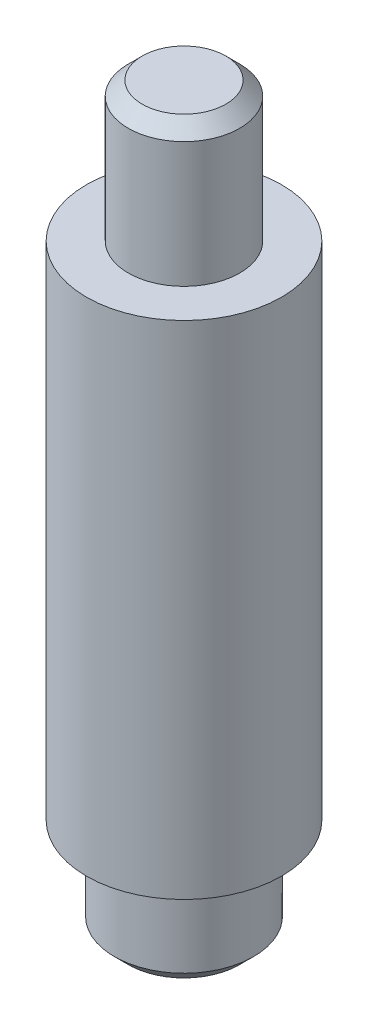
ISO-10303-21;
HEADER;
FILE_DESCRIPTION(('STEP AP214'),'2;1');
FILE_NAME('part.step','',(''),(''),'','','');
FILE_SCHEMA(('AUTOMOTIVE_DESIGN { 1 0 10303 214 1 1 1 1 }'));
ENDSEC;
DATA;
#1=APPLICATION_CONTEXT('core data for automotive mechanical design processes');
#2=APPLICATION_PROTOCOL_DEFINITION('international standard','automotive_design',2000,#1);
#3=PRODUCT_CONTEXT('',#1,'mechanical');
#4=PRODUCT('Part','Part','',(#3));
#5=PRODUCT_RELATED_PRODUCT_CATEGORY('part','',(#4));
#6=PRODUCT_DEFINITION_FORMATION('','',#4);
#7=PRODUCT_DEFINITION_CONTEXT('part definition',#1,'design');
#8=PRODUCT_DEFINITION('design','',#6,#7);
#9=PRODUCT_DEFINITION_SHAPE('','',#8);
#10=(LENGTH_UNIT() NAMED_UNIT(*) SI_UNIT(.MILLI.,.METRE.));
#11=(NAMED_UNIT(*) PLANE_ANGLE_UNIT() SI_UNIT($,.RADIAN.));
#12=(NAMED_UNIT(*) SI_UNIT($,.STERADIAN.) SOLID_ANGLE_UNIT());
#13=UNCERTAINTY_MEASURE_WITH_UNIT(LENGTH_MEASURE(1.E-05),#10,'distance_accuracy_value','');
#14=(GEOMETRIC_REPRESENTATION_CONTEXT(3) GLOBAL_UNCERTAINTY_ASSIGNED_CONTEXT((#13)) GLOBAL_UNIT_ASSIGNED_CONTEXT((#10,
#11,#12)) REPRESENTATION_CONTEXT('',''));
#15=CARTESIAN_POINT('',(0.,0.,0.));
#16=DIRECTION('',(0.,0.,1.));
#17=DIRECTION('',(1.,0.,0.));
#18=AXIS2_PLACEMENT_3D('',#15,#16,#17);
#19=CARTESIAN_POINT('',(0.,54.,3.));
#20=DIRECTION('',(0.,-1.,0.));
#21=DIRECTION('',(0.,0.,-1.));
#22=AXIS2_PLACEMENT_3D('',#19,#20,#21);
#23=PLANE('',#22);
#24=CARTESIAN_POINT('',(0.,54.,0.));
#25=DIRECTION('',(0.,-1.,0.));
#26=DIRECTION('',(0.,0.,-1.));
#27=AXIS2_PLACEMENT_3D('',#24,#25,#26);
#28=CIRCLE('',#27,3.);
#29=CARTESIAN_POINT('',(0.,54.,-3.));
#30=VERTEX_POINT('',#29);
#31=EDGE_CURVE('E10',#30,#30,#28,.T.);
#32=ORIENTED_EDGE('',*,*,#31,.F.);
#33=EDGE_LOOP('',(#32));
#34=FACE_BOUND('',#33,.T.);
#35=ADVANCED_FACE('F31',(#34),#23,.F.);
#36=CARTESIAN_POINT('',(0.,54.,0.));
#37=DIRECTION('',(0.,-1.,0.));
#38=DIRECTION('',(0.,0.,-1.));
#39=AXIS2_PLACEMENT_3D('',#36,#37,#38);
#40=CONICAL_SURFACE('',#39,3.,0.785398163397448);
#41=CARTESIAN_POINT('',(0.,53.,0.));
#42=DIRECTION('',(0.,-1.,0.));
#43=DIRECTION('',(0.,0.,-1.));
#44=AXIS2_PLACEMENT_3D('',#41,#42,#43);
#45=CIRCLE('',#44,4.);
#46=CARTESIAN_POINT('',(0.,53.,-4.));
#47=VERTEX_POINT('',#46);
#48=EDGE_CURVE('E39',#47,#47,#45,.T.);
#49=ORIENTED_EDGE('',*,*,#48,.F.);
#50=EDGE_LOOP('',(#49));
#51=FACE_BOUND('',#50,.T.);
#52=ORIENTED_EDGE('',*,*,#31,.T.);
#53=EDGE_LOOP('',(#52));
#54=FACE_BOUND('',#53,.T.);
#55=ADVANCED_FACE('F98',(#51,#54),#40,.T.);
#56=CARTESIAN_POINT('',(0.,0.,0.));
#57=DIRECTION('',(0.,-1.,0.));
#58=DIRECTION('',(0.,0.,-1.));
#59=AXIS2_PLACEMENT_3D('',#56,#57,#58);
#60=CYLINDRICAL_SURFACE('',#59,4.);
#61=CARTESIAN_POINT('',(0.,44.,0.));
#62=DIRECTION('',(0.,-1.,0.));
#63=DIRECTION('',(0.,0.,-1.));
#64=AXIS2_PLACEMENT_3D('',#61,#62,#63);
#65=CIRCLE('',#64,4.);
#66=CARTESIAN_POINT('',(0.,44.,-4.));
#67=VERTEX_POINT('',#66);
#68=EDGE_CURVE('E43',#67,#67,#65,.T.);
#69=ORIENTED_EDGE('',*,*,#68,.F.);
#70=EDGE_LOOP('',(#69));
#71=FACE_BOUND('',#70,.T.);
#72=ORIENTED_EDGE('',*,*,#48,.T.);
#73=EDGE_LOOP('',(#72));
#74=FACE_BOUND('',#73,.T.);
#75=ADVANCED_FACE('F92',(#71,#74),#60,.T.);
#76=CARTESIAN_POINT('',(0.,44.,7.));
#77=DIRECTION('',(0.,-1.,0.));
#78=DIRECTION('',(0.,0.,-1.));
#79=AXIS2_PLACEMENT_3D('',#76,#77,#78);
#80=PLANE('',#79);
#81=CARTESIAN_POINT('',(0.,44.,0.));
#82=DIRECTION('',(0.,-1.,0.));
#83=DIRECTION('',(0.,0.,-1.));
#84=AXIS2_PLACEMENT_3D('',#81,#82,#83);
#85=CIRCLE('',#84,7.);
#86=CARTESIAN_POINT('',(0.,44.,-7.));
#87=VERTEX_POINT('',#86);
#88=EDGE_CURVE('E50',#87,#87,#85,.T.);
#89=ORIENTED_EDGE('',*,*,#88,.F.);
#90=EDGE_LOOP('',(#89));
#91=FACE_BOUND('',#90,.T.);
#92=ORIENTED_EDGE('',*,*,#68,.T.);
#93=EDGE_LOOP('',(#92));
#94=FACE_BOUND('',#93,.T.);
#95=ADVANCED_FACE('F88',(#91,#94),#80,.F.);
#96=CARTESIAN_POINT('',(0.,0.,0.));
#97=DIRECTION('',(0.,-1.,0.));
#98=DIRECTION('',(0.,0.,-1.));
#99=AXIS2_PLACEMENT_3D('',#96,#97,#98);
#100=CYLINDRICAL_SURFACE('',#99,7.);
#101=CARTESIAN_POINT('',(0.,8.,0.));
#102=DIRECTION('',(0.,-1.,0.));
#103=DIRECTION('',(0.,0.,-1.));
#104=AXIS2_PLACEMENT_3D('',#101,#102,#103);
#105=CIRCLE('',#104,7.);
#106=CARTESIAN_POINT('',(0.,8.,-7.));
#107=VERTEX_POINT('',#106);
#108=EDGE_CURVE('E55',#107,#107,#105,.T.);
#109=ORIENTED_EDGE('',*,*,#108,.F.);
#110=EDGE_LOOP('',(#109));
#111=FACE_BOUND('',#110,.T.);
#112=ORIENTED_EDGE('',*,*,#88,.T.);
#113=EDGE_LOOP('',(#112));
#114=FACE_BOUND('',#113,.T.);
#115=ADVANCED_FACE('F85',(#111,#114),#100,.T.);
#116=CARTESIAN_POINT('',(0.,8.,5.));
#117=DIRECTION('',(0.,1.,0.));
#118=DIRECTION('',(0.,0.,1.));
#119=AXIS2_PLACEMENT_3D('',#116,#117,#118);
#120=PLANE('',#119);
#121=CARTESIAN_POINT('',(0.,8.,0.));
#122=DIRECTION('',(0.,-1.,0.));
#123=DIRECTION('',(0.,0.,-1.));
#124=AXIS2_PLACEMENT_3D('',#121,#122,#123);
#125=CIRCLE('',#124,5.);
#126=CARTESIAN_POINT('',(0.,8.,-5.));
#127=VERTEX_POINT('',#126);
#128=EDGE_CURVE('E54',#127,#127,#125,.T.);
#129=ORIENTED_EDGE('',*,*,#128,.F.);
#130=EDGE_LOOP('',(#129));
#131=FACE_BOUND('',#130,.T.);
#132=ORIENTED_EDGE('',*,*,#108,.T.);
#133=EDGE_LOOP('',(#132));
#134=FACE_BOUND('',#133,.T.);
#135=ADVANCED_FACE('F78',(#131,#134),#120,.F.);
#136=CARTESIAN_POINT('',(0.,0.,0.));
#137=DIRECTION('',(0.,-1.,0.));
#138=DIRECTION('',(0.,0.,-1.));
#139=AXIS2_PLACEMENT_3D('',#136,#137,#138);
#140=CYLINDRICAL_SURFACE('',#139,5.);
#141=CARTESIAN_POINT('',(0.,2.,0.));
#142=DIRECTION('',(0.,-1.,0.));
#143=DIRECTION('',(0.,0.,-1.));
#144=AXIS2_PLACEMENT_3D('',#141,#142,#143);
#145=CIRCLE('',#144,5.);
#146=CARTESIAN_POINT('',(0.,2.,-5.));
#147=VERTEX_POINT('',#146);
#148=EDGE_CURVE('E59',#147,#147,#145,.T.);
#149=ORIENTED_EDGE('',*,*,#148,.F.);
#150=EDGE_LOOP('',(#149));
#151=FACE_BOUND('',#150,.T.);
#152=ORIENTED_EDGE('',*,*,#128,.T.);
#153=EDGE_LOOP('',(#152));
#154=FACE_BOUND('',#153,.T.);
#155=ADVANCED_FACE('F68',(#151,#154),#140,.T.);
#156=CARTESIAN_POINT('',(0.,2.,0.));
#157=DIRECTION('',(0.,1.,0.));
#158=DIRECTION('',(0.,0.,1.));
#159=AXIS2_PLACEMENT_3D('',#156,#157,#158);
#160=CONICAL_SURFACE('',#159,5.,0.785398163397449);
#161=CARTESIAN_POINT('',(0.,1.00000000000012,0.));
#162=DIRECTION('',(0.,-1.,0.));
#163=DIRECTION('',(0.,0.,-1.));
#164=AXIS2_PLACEMENT_3D('',#161,#162,#163);
#165=CIRCLE('',#164,4.00000000000012);
#166=CARTESIAN_POINT('',(0.,1.00000000000012,-4.00000000000012));
#167=VERTEX_POINT('',#166);
#168=EDGE_CURVE('E63',#167,#167,#165,.T.);
#169=ORIENTED_EDGE('',*,*,#168,.F.);
#170=EDGE_LOOP('',(#169));
#171=FACE_BOUND('',#170,.T.);
#172=ORIENTED_EDGE('',*,*,#148,.T.);
#173=EDGE_LOOP('',(#172));
#174=FACE_BOUND('',#173,.T.);
#175=ADVANCED_FACE('F70',(#171,#174),#160,.T.);
#176=CARTESIAN_POINT('',(0.,1.00000000000012,0.));
#177=DIRECTION('',(0.,1.,0.));
#178=DIRECTION('',(0.,0.,1.));
#179=AXIS2_PLACEMENT_3D('',#176,#177,#178);
#180=PLANE('',#179);
#181=ORIENTED_EDGE('',*,*,#168,.T.);
#182=EDGE_LOOP('',(#181));
#183=FACE_BOUND('',#182,.T.);
#184=ADVANCED_FACE('F61',(#183),#180,.F.);
#185=CLOSED_SHELL('',(#35,#55,#75,#95,#115,#135,#155,#175,#184));
#186=MANIFOLD_SOLID_BREP('B2',#185);
#187=ADVANCED_BREP_SHAPE_REPRESENTATION('',(#18,#186),#14);
#188=SHAPE_DEFINITION_REPRESENTATION(#9,#187);
ENDSEC;
END-ISO-10303-21;
